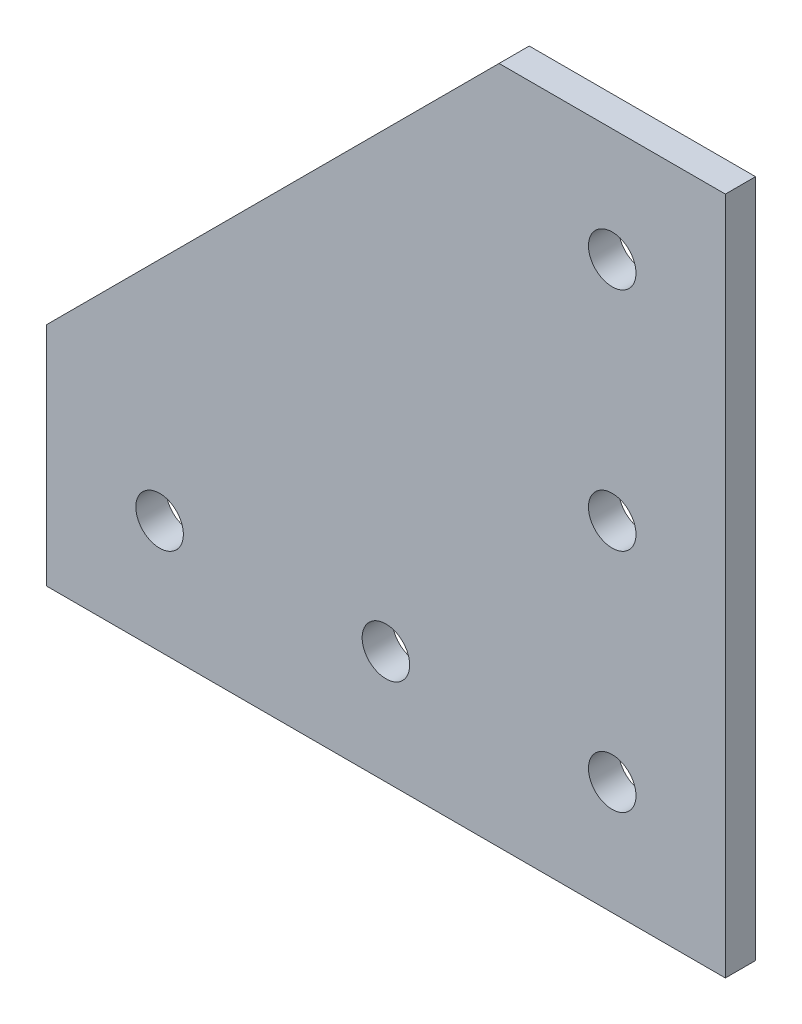
ISO-10303-21;
HEADER;
FILE_DESCRIPTION(('STEP AP214'),'2;1');
FILE_NAME('part.step','',(''),(''),'','','');
FILE_SCHEMA(('AUTOMOTIVE_DESIGN { 1 0 10303 214 1 1 1 1 }'));
ENDSEC;
DATA;
#1=APPLICATION_CONTEXT('core data for automotive mechanical design processes');
#2=APPLICATION_PROTOCOL_DEFINITION('international standard','automotive_design',2000,#1);
#3=PRODUCT_CONTEXT('',#1,'mechanical');
#4=PRODUCT('Part','Part','',(#3));
#5=PRODUCT_RELATED_PRODUCT_CATEGORY('part','',(#4));
#6=PRODUCT_DEFINITION_FORMATION('','',#4);
#7=PRODUCT_DEFINITION_CONTEXT('part definition',#1,'design');
#8=PRODUCT_DEFINITION('design','',#6,#7);
#9=PRODUCT_DEFINITION_SHAPE('','',#8);
#10=(LENGTH_UNIT() NAMED_UNIT(*) SI_UNIT(.MILLI.,.METRE.));
#11=(NAMED_UNIT(*) PLANE_ANGLE_UNIT() SI_UNIT($,.RADIAN.));
#12=(NAMED_UNIT(*) SI_UNIT($,.STERADIAN.) SOLID_ANGLE_UNIT());
#13=UNCERTAINTY_MEASURE_WITH_UNIT(LENGTH_MEASURE(1.E-05),#10,'distance_accuracy_value','');
#14=(GEOMETRIC_REPRESENTATION_CONTEXT(3) GLOBAL_UNCERTAINTY_ASSIGNED_CONTEXT((#13)) GLOBAL_UNIT_ASSIGNED_CONTEXT((#10,
#11,#12)) REPRESENTATION_CONTEXT('',''));
#15=CARTESIAN_POINT('',(0.,0.,0.));
#16=DIRECTION('',(0.,0.,1.));
#17=DIRECTION('',(1.,0.,0.));
#18=AXIS2_PLACEMENT_3D('',#15,#16,#17);
#19=CARTESIAN_POINT('',(-105.984614053306,7.31572343371409,4.));
#20=DIRECTION('',(0.,0.,-1.));
#21=DIRECTION('',(-1.,0.,0.));
#22=AXIS2_PLACEMENT_3D('',#19,#20,#21);
#23=PLANE('',#22);
#24=CARTESIAN_POINT('',(-30.9846140533057,22.3157234337141,4.));
#25=DIRECTION('',(0.,0.,1.));
#26=DIRECTION('',(1.,0.,0.));
#27=AXIS2_PLACEMENT_3D('',#24,#25,#26);
#28=CIRCLE('',#27,3.15);
#29=CARTESIAN_POINT('',(-27.8346140533057,22.3157234337141,4.));
#30=VERTEX_POINT('',#29);
#31=EDGE_CURVE('E177',#30,#30,#28,.T.);
#32=ORIENTED_EDGE('',*,*,#31,.F.);
#33=EDGE_LOOP('',(#32));
#34=FACE_BOUND('',#33,.T.);
#35=CARTESIAN_POINT('',(-0.984614053305657,82.3157234337141,4.));
#36=DIRECTION('',(0.,0.,1.));
#37=DIRECTION('',(1.,0.,0.));
#38=AXIS2_PLACEMENT_3D('',#35,#36,#37);
#39=CIRCLE('',#38,3.15);
#40=CARTESIAN_POINT('',(2.16538594669434,82.3157234337141,4.));
#41=VERTEX_POINT('',#40);
#42=EDGE_CURVE('E189',#41,#41,#39,.T.);
#43=ORIENTED_EDGE('',*,*,#42,.F.);
#44=EDGE_LOOP('',(#43));
#45=FACE_BOUND('',#44,.T.);
#46=DIRECTION('',(-0.707106781186547,-0.707106781186548,0.));
#47=VECTOR('',#46,1.);
#48=CARTESIAN_POINT('',(-75.9846140533056,37.3157234337141,4.));
#49=LINE('',#48,#47);
#50=CARTESIAN_POINT('',(-15.9846140533057,97.3157234337141,4.));
#51=VERTEX_POINT('',#50);
#52=CARTESIAN_POINT('',(-75.9846140533056,37.3157234337141,4.));
#53=VERTEX_POINT('',#52);
#54=EDGE_CURVE('E117',#51,#53,#49,.T.);
#55=ORIENTED_EDGE('',*,*,#54,.T.);
#56=DIRECTION('',(0.,-1.,0.));
#57=VECTOR('',#56,1.);
#58=CARTESIAN_POINT('',(-75.9846140533056,7.31572343371409,4.));
#59=LINE('',#58,#57);
#60=CARTESIAN_POINT('',(-75.9846140533056,7.31572343371409,4.));
#61=VERTEX_POINT('',#60);
#62=EDGE_CURVE('E84',#53,#61,#59,.T.);
#63=ORIENTED_EDGE('',*,*,#62,.T.);
#64=DIRECTION('',(1.,0.,0.));
#65=VECTOR('',#64,1.);
#66=CARTESIAN_POINT('',(-75.9846140533056,7.31572343371409,4.));
#67=LINE('',#66,#65);
#68=CARTESIAN_POINT('',(14.0153859466944,7.31572343371409,4.));
#69=VERTEX_POINT('',#68);
#70=EDGE_CURVE('E88',#61,#69,#67,.T.);
#71=ORIENTED_EDGE('',*,*,#70,.T.);
#72=DIRECTION('',(0.,1.,0.));
#73=VECTOR('',#72,1.);
#74=CARTESIAN_POINT('',(14.0153859466943,97.3157234337141,4.));
#75=LINE('',#74,#73);
#76=CARTESIAN_POINT('',(14.0153859466943,97.3157234337141,4.));
#77=VERTEX_POINT('',#76);
#78=EDGE_CURVE('E92',#69,#77,#75,.T.);
#79=ORIENTED_EDGE('',*,*,#78,.T.);
#80=DIRECTION('',(-1.,0.,0.));
#81=VECTOR('',#80,1.);
#82=CARTESIAN_POINT('',(14.0153859466943,97.3157234337141,4.));
#83=LINE('',#82,#81);
#84=EDGE_CURVE('E50',#77,#51,#83,.T.);
#85=ORIENTED_EDGE('',*,*,#84,.T.);
#86=EDGE_LOOP('',(#55,#63,#71,#79,#85));
#87=FACE_BOUND('',#86,.T.);
#88=CARTESIAN_POINT('',(-0.984614053305657,52.3157234337141,4.));
#89=DIRECTION('',(0.,0.,1.));
#90=DIRECTION('',(1.,0.,0.));
#91=AXIS2_PLACEMENT_3D('',#88,#89,#90);
#92=CIRCLE('',#91,3.15);
#93=CARTESIAN_POINT('',(2.16538594669434,52.3157234337141,4.));
#94=VERTEX_POINT('',#93);
#95=EDGE_CURVE('E112',#94,#94,#92,.T.);
#96=ORIENTED_EDGE('',*,*,#95,.F.);
#97=EDGE_LOOP('',(#96));
#98=FACE_BOUND('',#97,.T.);
#99=CARTESIAN_POINT('',(-0.984614053305672,22.3157234337141,4.));
#100=DIRECTION('',(0.,0.,1.));
#101=DIRECTION('',(1.,0.,0.));
#102=AXIS2_PLACEMENT_3D('',#99,#100,#101);
#103=CIRCLE('',#102,3.15);
#104=CARTESIAN_POINT('',(2.16538594669433,22.3157234337141,4.));
#105=VERTEX_POINT('',#104);
#106=EDGE_CURVE('E183',#105,#105,#103,.T.);
#107=ORIENTED_EDGE('',*,*,#106,.F.);
#108=EDGE_LOOP('',(#107));
#109=FACE_BOUND('',#108,.T.);
#110=CARTESIAN_POINT('',(-60.9846140533056,22.3157234337141,4.));
#111=DIRECTION('',(0.,0.,1.));
#112=DIRECTION('',(1.,0.,0.));
#113=AXIS2_PLACEMENT_3D('',#110,#111,#112);
#114=CIRCLE('',#113,3.15);
#115=CARTESIAN_POINT('',(-57.8346140533056,22.3157234337141,4.));
#116=VERTEX_POINT('',#115);
#117=EDGE_CURVE('E168',#116,#116,#114,.T.);
#118=ORIENTED_EDGE('',*,*,#117,.F.);
#119=EDGE_LOOP('',(#118));
#120=FACE_BOUND('',#119,.T.);
#121=ADVANCED_FACE('F33',(#34,#45,#87,#98,#109,#120),#23,.F.);
#122=CARTESIAN_POINT('',(-105.984614053306,7.31572343371409,0.));
#123=DIRECTION('',(0.,0.,-1.));
#124=DIRECTION('',(-1.,0.,0.));
#125=AXIS2_PLACEMENT_3D('',#122,#123,#124);
#126=PLANE('',#125);
#127=CARTESIAN_POINT('',(-30.9846140533057,22.3157234337141,0.));
#128=DIRECTION('',(0.,0.,1.));
#129=DIRECTION('',(1.,0.,0.));
#130=AXIS2_PLACEMENT_3D('',#127,#128,#129);
#131=CIRCLE('',#130,3.15);
#132=CARTESIAN_POINT('',(-27.8346140533057,22.3157234337141,0.));
#133=VERTEX_POINT('',#132);
#134=EDGE_CURVE('E174',#133,#133,#131,.T.);
#135=ORIENTED_EDGE('',*,*,#134,.T.);
#136=EDGE_LOOP('',(#135));
#137=FACE_BOUND('',#136,.T.);
#138=CARTESIAN_POINT('',(-0.984614053305657,82.3157234337141,0.));
#139=DIRECTION('',(0.,0.,1.));
#140=DIRECTION('',(1.,0.,0.));
#141=AXIS2_PLACEMENT_3D('',#138,#139,#140);
#142=CIRCLE('',#141,3.15);
#143=CARTESIAN_POINT('',(2.16538594669434,82.3157234337141,0.));
#144=VERTEX_POINT('',#143);
#145=EDGE_CURVE('E186',#144,#144,#142,.T.);
#146=ORIENTED_EDGE('',*,*,#145,.T.);
#147=EDGE_LOOP('',(#146));
#148=FACE_BOUND('',#147,.T.);
#149=DIRECTION('',(-0.707106781186547,-0.707106781186548,0.));
#150=VECTOR('',#149,1.);
#151=CARTESIAN_POINT('',(-75.9846140533056,37.3157234337141,0.));
#152=LINE('',#151,#150);
#153=CARTESIAN_POINT('',(-15.9846140533057,97.3157234337141,0.));
#154=VERTEX_POINT('',#153);
#155=CARTESIAN_POINT('',(-75.9846140533056,37.3157234337141,0.));
#156=VERTEX_POINT('',#155);
#157=EDGE_CURVE('E108',#154,#156,#152,.T.);
#158=ORIENTED_EDGE('',*,*,#157,.F.);
#159=DIRECTION('',(-1.,0.,0.));
#160=VECTOR('',#159,1.);
#161=CARTESIAN_POINT('',(14.0153859466943,97.3157234337141,0.));
#162=LINE('',#161,#160);
#163=CARTESIAN_POINT('',(14.0153859466943,97.3157234337141,0.));
#164=VERTEX_POINT('',#163);
#165=EDGE_CURVE('E76',#164,#154,#162,.T.);
#166=ORIENTED_EDGE('',*,*,#165,.F.);
#167=DIRECTION('',(0.,1.,0.));
#168=VECTOR('',#167,1.);
#169=CARTESIAN_POINT('',(14.0153859466943,97.3157234337141,0.));
#170=LINE('',#169,#168);
#171=CARTESIAN_POINT('',(14.0153859466944,7.31572343371409,0.));
#172=VERTEX_POINT('',#171);
#173=EDGE_CURVE('E70',#172,#164,#170,.T.);
#174=ORIENTED_EDGE('',*,*,#173,.F.);
#175=DIRECTION('',(1.,0.,0.));
#176=VECTOR('',#175,1.);
#177=CARTESIAN_POINT('',(-75.9846140533056,7.31572343371409,0.));
#178=LINE('',#177,#176);
#179=CARTESIAN_POINT('',(-75.9846140533056,7.31572343371409,0.));
#180=VERTEX_POINT('',#179);
#181=EDGE_CURVE('E99',#180,#172,#178,.T.);
#182=ORIENTED_EDGE('',*,*,#181,.F.);
#183=DIRECTION('',(0.,-1.,0.));
#184=VECTOR('',#183,1.);
#185=CARTESIAN_POINT('',(-75.9846140533056,7.31572343371409,0.));
#186=LINE('',#185,#184);
#187=EDGE_CURVE('E111',#156,#180,#186,.T.);
#188=ORIENTED_EDGE('',*,*,#187,.F.);
#189=EDGE_LOOP('',(#158,#166,#174,#182,#188));
#190=FACE_BOUND('',#189,.T.);
#191=CARTESIAN_POINT('',(-0.984614053305657,52.3157234337141,0.));
#192=DIRECTION('',(0.,0.,1.));
#193=DIRECTION('',(1.,0.,0.));
#194=AXIS2_PLACEMENT_3D('',#191,#192,#193);
#195=CIRCLE('',#194,3.15);
#196=CARTESIAN_POINT('',(2.16538594669434,52.3157234337141,0.));
#197=VERTEX_POINT('',#196);
#198=EDGE_CURVE('E192',#197,#197,#195,.T.);
#199=ORIENTED_EDGE('',*,*,#198,.T.);
#200=EDGE_LOOP('',(#199));
#201=FACE_BOUND('',#200,.T.);
#202=CARTESIAN_POINT('',(-0.984614053305672,22.3157234337141,0.));
#203=DIRECTION('',(0.,0.,1.));
#204=DIRECTION('',(1.,0.,0.));
#205=AXIS2_PLACEMENT_3D('',#202,#203,#204);
#206=CIRCLE('',#205,3.15);
#207=CARTESIAN_POINT('',(2.16538594669433,22.3157234337141,0.));
#208=VERTEX_POINT('',#207);
#209=EDGE_CURVE('E180',#208,#208,#206,.T.);
#210=ORIENTED_EDGE('',*,*,#209,.T.);
#211=EDGE_LOOP('',(#210));
#212=FACE_BOUND('',#211,.T.);
#213=CARTESIAN_POINT('',(-60.9846140533056,22.3157234337141,0.));
#214=DIRECTION('',(0.,0.,1.));
#215=DIRECTION('',(1.,0.,0.));
#216=AXIS2_PLACEMENT_3D('',#213,#214,#215);
#217=CIRCLE('',#216,3.15);
#218=CARTESIAN_POINT('',(-57.8346140533056,22.3157234337141,0.));
#219=VERTEX_POINT('',#218);
#220=EDGE_CURVE('E171',#219,#219,#217,.T.);
#221=ORIENTED_EDGE('',*,*,#220,.T.);
#222=EDGE_LOOP('',(#221));
#223=FACE_BOUND('',#222,.T.);
#224=ADVANCED_FACE('F121',(#137,#148,#190,#201,#212,#223),#126,.T.);
#225=CARTESIAN_POINT('',(-75.9846140533056,37.3157234337141,4.));
#226=DIRECTION('',(0.707106781186548,-0.707106781186547,0.));
#227=DIRECTION('',(0.707106781186547,0.707106781186548,0.));
#228=AXIS2_PLACEMENT_3D('',#225,#226,#227);
#229=PLANE('',#228);
#230=ORIENTED_EDGE('',*,*,#157,.T.);
#231=DIRECTION('',(0.,0.,-1.));
#232=VECTOR('',#231,1.);
#233=CARTESIAN_POINT('',(-75.9846140533056,37.3157234337141,4.));
#234=LINE('',#233,#232);
#235=EDGE_CURVE('E11',#53,#156,#234,.T.);
#236=ORIENTED_EDGE('',*,*,#235,.F.);
#237=ORIENTED_EDGE('',*,*,#54,.F.);
#238=DIRECTION('',(0.,0.,-1.));
#239=VECTOR('',#238,1.);
#240=CARTESIAN_POINT('',(-15.9846140533057,97.3157234337141,4.));
#241=LINE('',#240,#239);
#242=EDGE_CURVE('E104',#51,#154,#241,.T.);
#243=ORIENTED_EDGE('',*,*,#242,.T.);
#244=EDGE_LOOP('',(#230,#236,#237,#243));
#245=FACE_BOUND('',#244,.T.);
#246=ADVANCED_FACE('F35',(#245),#229,.F.);
#247=CARTESIAN_POINT('',(-75.9846140533056,7.31572343371409,4.));
#248=DIRECTION('',(1.,0.,0.));
#249=DIRECTION('',(0.,0.,-1.));
#250=AXIS2_PLACEMENT_3D('',#247,#248,#249);
#251=PLANE('',#250);
#252=ORIENTED_EDGE('',*,*,#187,.T.);
#253=DIRECTION('',(0.,0.,-1.));
#254=VECTOR('',#253,1.);
#255=CARTESIAN_POINT('',(-75.9846140533056,7.31572343371409,4.));
#256=LINE('',#255,#254);
#257=EDGE_CURVE('E42',#61,#180,#256,.T.);
#258=ORIENTED_EDGE('',*,*,#257,.F.);
#259=ORIENTED_EDGE('',*,*,#62,.F.);
#260=ORIENTED_EDGE('',*,*,#235,.T.);
#261=EDGE_LOOP('',(#252,#258,#259,#260));
#262=FACE_BOUND('',#261,.T.);
#263=ADVANCED_FACE('F249',(#262),#251,.F.);
#264=CARTESIAN_POINT('',(-75.9846140533056,7.31572343371409,4.));
#265=DIRECTION('',(0.,1.,0.));
#266=DIRECTION('',(0.,0.,1.));
#267=AXIS2_PLACEMENT_3D('',#264,#265,#266);
#268=PLANE('',#267);
#269=ORIENTED_EDGE('',*,*,#181,.T.);
#270=DIRECTION('',(0.,0.,-1.));
#271=VECTOR('',#270,1.);
#272=CARTESIAN_POINT('',(14.0153859466944,7.31572343371409,4.));
#273=LINE('',#272,#271);
#274=EDGE_CURVE('E96',#69,#172,#273,.T.);
#275=ORIENTED_EDGE('',*,*,#274,.F.);
#276=ORIENTED_EDGE('',*,*,#70,.F.);
#277=ORIENTED_EDGE('',*,*,#257,.T.);
#278=EDGE_LOOP('',(#269,#275,#276,#277));
#279=FACE_BOUND('',#278,.T.);
#280=ADVANCED_FACE('F97',(#279),#268,.F.);
#281=CARTESIAN_POINT('',(14.0153859466943,97.3157234337141,4.));
#282=DIRECTION('',(-1.,0.,0.));
#283=DIRECTION('',(0.,-1.,0.));
#284=AXIS2_PLACEMENT_3D('',#281,#282,#283);
#285=PLANE('',#284);
#286=ORIENTED_EDGE('',*,*,#173,.T.);
#287=DIRECTION('',(0.,0.,-1.));
#288=VECTOR('',#287,1.);
#289=CARTESIAN_POINT('',(14.0153859466943,97.3157234337141,4.));
#290=LINE('',#289,#288);
#291=EDGE_CURVE('E100',#77,#164,#290,.T.);
#292=ORIENTED_EDGE('',*,*,#291,.F.);
#293=ORIENTED_EDGE('',*,*,#78,.F.);
#294=ORIENTED_EDGE('',*,*,#274,.T.);
#295=EDGE_LOOP('',(#286,#292,#293,#294));
#296=FACE_BOUND('',#295,.T.);
#297=ADVANCED_FACE('F102',(#296),#285,.F.);
#298=CARTESIAN_POINT('',(14.0153859466943,97.3157234337141,4.));
#299=DIRECTION('',(0.,-1.,0.));
#300=DIRECTION('',(0.,0.,-1.));
#301=AXIS2_PLACEMENT_3D('',#298,#299,#300);
#302=PLANE('',#301);
#303=ORIENTED_EDGE('',*,*,#165,.T.);
#304=ORIENTED_EDGE('',*,*,#242,.F.);
#305=ORIENTED_EDGE('',*,*,#84,.F.);
#306=ORIENTED_EDGE('',*,*,#291,.T.);
#307=EDGE_LOOP('',(#303,#304,#305,#306));
#308=FACE_BOUND('',#307,.T.);
#309=ADVANCED_FACE('F126',(#308),#302,.F.);
#310=CARTESIAN_POINT('',(-0.984614053305657,52.3157234337141,4.));
#311=DIRECTION('',(0.,0.,-1.));
#312=DIRECTION('',(-1.,0.,0.));
#313=AXIS2_PLACEMENT_3D('',#310,#311,#312);
#314=CYLINDRICAL_SURFACE('',#313,3.15);
#315=ORIENTED_EDGE('',*,*,#95,.T.);
#316=EDGE_LOOP('',(#315));
#317=FACE_BOUND('',#316,.T.);
#318=ORIENTED_EDGE('',*,*,#198,.F.);
#319=EDGE_LOOP('',(#318));
#320=FACE_BOUND('',#319,.T.);
#321=ADVANCED_FACE('F128',(#317,#320),#314,.F.);
#322=CARTESIAN_POINT('',(-0.984614053305657,82.3157234337141,4.));
#323=DIRECTION('',(0.,0.,-1.));
#324=DIRECTION('',(-1.,0.,0.));
#325=AXIS2_PLACEMENT_3D('',#322,#323,#324);
#326=CYLINDRICAL_SURFACE('',#325,3.15);
#327=ORIENTED_EDGE('',*,*,#42,.T.);
#328=EDGE_LOOP('',(#327));
#329=FACE_BOUND('',#328,.T.);
#330=ORIENTED_EDGE('',*,*,#145,.F.);
#331=EDGE_LOOP('',(#330));
#332=FACE_BOUND('',#331,.T.);
#333=ADVANCED_FACE('F134',(#329,#332),#326,.F.);
#334=CARTESIAN_POINT('',(-0.984614053305672,22.3157234337141,4.));
#335=DIRECTION('',(0.,0.,-1.));
#336=DIRECTION('',(-1.,0.,0.));
#337=AXIS2_PLACEMENT_3D('',#334,#335,#336);
#338=CYLINDRICAL_SURFACE('',#337,3.15);
#339=ORIENTED_EDGE('',*,*,#106,.T.);
#340=EDGE_LOOP('',(#339));
#341=FACE_BOUND('',#340,.T.);
#342=ORIENTED_EDGE('',*,*,#209,.F.);
#343=EDGE_LOOP('',(#342));
#344=FACE_BOUND('',#343,.T.);
#345=ADVANCED_FACE('F151',(#341,#344),#338,.F.);
#346=CARTESIAN_POINT('',(-30.9846140533057,22.3157234337141,4.));
#347=DIRECTION('',(0.,0.,-1.));
#348=DIRECTION('',(-1.,0.,0.));
#349=AXIS2_PLACEMENT_3D('',#346,#347,#348);
#350=CYLINDRICAL_SURFACE('',#349,3.15);
#351=ORIENTED_EDGE('',*,*,#31,.T.);
#352=EDGE_LOOP('',(#351));
#353=FACE_BOUND('',#352,.T.);
#354=ORIENTED_EDGE('',*,*,#134,.F.);
#355=EDGE_LOOP('',(#354));
#356=FACE_BOUND('',#355,.T.);
#357=ADVANCED_FACE('F155',(#353,#356),#350,.F.);
#358=CARTESIAN_POINT('',(-60.9846140533056,22.3157234337141,4.));
#359=DIRECTION('',(0.,0.,-1.));
#360=DIRECTION('',(-1.,0.,0.));
#361=AXIS2_PLACEMENT_3D('',#358,#359,#360);
#362=CYLINDRICAL_SURFACE('',#361,3.15);
#363=ORIENTED_EDGE('',*,*,#117,.T.);
#364=EDGE_LOOP('',(#363));
#365=FACE_BOUND('',#364,.T.);
#366=ORIENTED_EDGE('',*,*,#220,.F.);
#367=EDGE_LOOP('',(#366));
#368=FACE_BOUND('',#367,.T.);
#369=ADVANCED_FACE('F159',(#365,#368),#362,.F.);
#370=CLOSED_SHELL('',(#121,#224,#246,#263,#280,#297,#309,#321,#333,#345,#357,#369));
#371=MANIFOLD_SOLID_BREP('B2',#370);
#372=ADVANCED_BREP_SHAPE_REPRESENTATION('',(#18,#371),#14);
#373=SHAPE_DEFINITION_REPRESENTATION(#9,#372);
ENDSEC;
END-ISO-10303-21;
